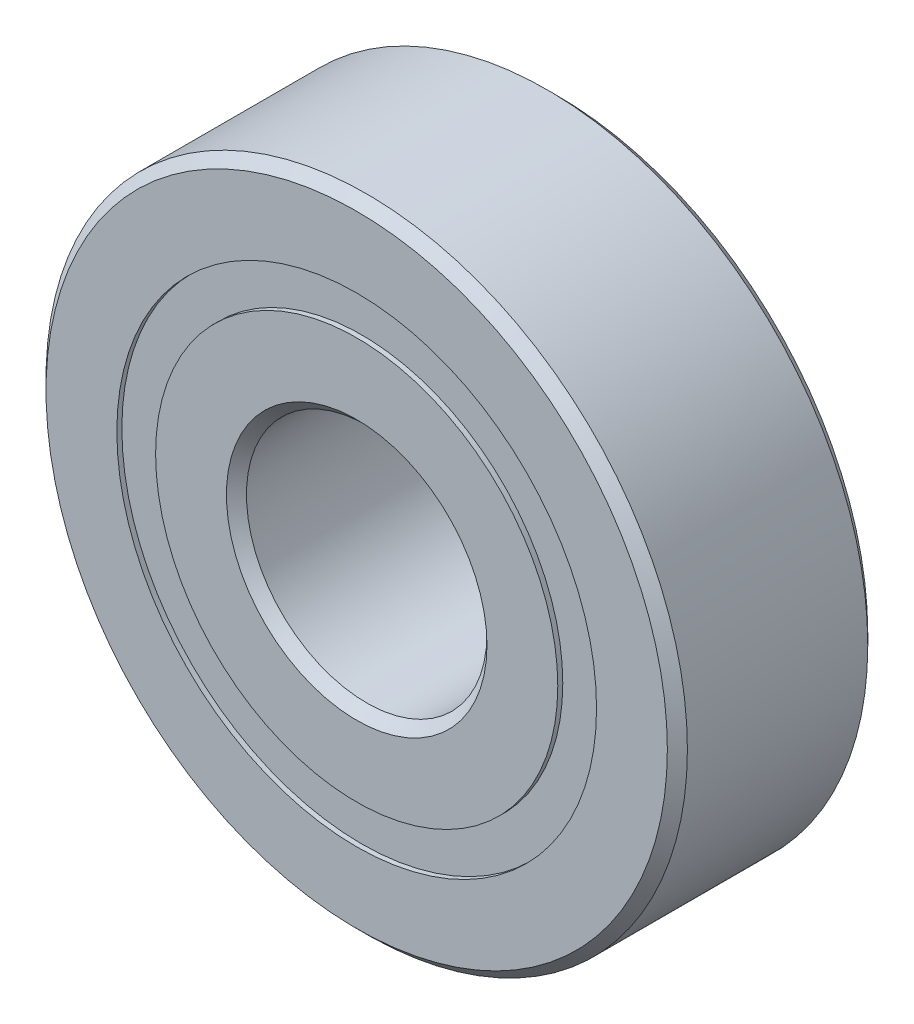
ISO-10303-21;
HEADER;
FILE_DESCRIPTION(('STEP AP214'),'2;1');
FILE_NAME('part.step','',(''),(''),'','','');
FILE_SCHEMA(('AUTOMOTIVE_DESIGN { 1 0 10303 214 1 1 1 1 }'));
ENDSEC;
DATA;
#1=APPLICATION_CONTEXT('core data for automotive mechanical design processes');
#2=APPLICATION_PROTOCOL_DEFINITION('international standard','automotive_design',2000,#1);
#3=PRODUCT_CONTEXT('',#1,'mechanical');
#4=PRODUCT('Part','Part','',(#3));
#5=PRODUCT_RELATED_PRODUCT_CATEGORY('part','',(#4));
#6=PRODUCT_DEFINITION_FORMATION('','',#4);
#7=PRODUCT_DEFINITION_CONTEXT('part definition',#1,'design');
#8=PRODUCT_DEFINITION('design','',#6,#7);
#9=PRODUCT_DEFINITION_SHAPE('','',#8);
#10=(LENGTH_UNIT() NAMED_UNIT(*) SI_UNIT(.MILLI.,.METRE.));
#11=(NAMED_UNIT(*) PLANE_ANGLE_UNIT() SI_UNIT($,.RADIAN.));
#12=(NAMED_UNIT(*) SI_UNIT($,.STERADIAN.) SOLID_ANGLE_UNIT());
#13=UNCERTAINTY_MEASURE_WITH_UNIT(LENGTH_MEASURE(1.E-05),#10,'distance_accuracy_value','');
#14=(GEOMETRIC_REPRESENTATION_CONTEXT(3) GLOBAL_UNCERTAINTY_ASSIGNED_CONTEXT((#13)) GLOBAL_UNIT_ASSIGNED_CONTEXT((#10,
#11,#12)) REPRESENTATION_CONTEXT('',''));
#15=CARTESIAN_POINT('',(0.,0.,0.));
#16=DIRECTION('',(0.,0.,1.));
#17=DIRECTION('',(1.,0.,0.));
#18=AXIS2_PLACEMENT_3D('',#15,#16,#17);
#19=CARTESIAN_POINT('',(0.,11.967032967033,-4.75));
#20=DIRECTION('',(0.,0.,1.));
#21=DIRECTION('',(1.,0.,0.));
#22=AXIS2_PLACEMENT_3D('',#19,#20,#21);
#23=PLANE('',#22);
#24=CARTESIAN_POINT('',(0.,0.,-4.75));
#25=DIRECTION('',(0.,0.,1.));
#26=DIRECTION('',(1.,0.,0.));
#27=AXIS2_PLACEMENT_3D('',#24,#25,#26);
#28=CIRCLE('',#27,11.967032967033);
#29=CARTESIAN_POINT('',(11.967032967033,0.,-4.75));
#30=VERTEX_POINT('',#29);
#31=EDGE_CURVE('E59',#30,#30,#28,.T.);
#32=ORIENTED_EDGE('',*,*,#31,.F.);
#33=EDGE_LOOP('',(#32));
#34=FACE_BOUND('',#33,.T.);
#35=CARTESIAN_POINT('',(0.,0.,-4.75));
#36=DIRECTION('',(0.,0.,1.));
#37=DIRECTION('',(1.,0.,0.));
#38=AXIS2_PLACEMENT_3D('',#35,#36,#37);
#39=CIRCLE('',#38,10.032967032967);
#40=CARTESIAN_POINT('',(10.032967032967,0.,-4.75));
#41=VERTEX_POINT('',#40);
#42=EDGE_CURVE('E11',#41,#41,#39,.T.);
#43=ORIENTED_EDGE('',*,*,#42,.T.);
#44=EDGE_LOOP('',(#43));
#45=FACE_BOUND('',#44,.T.);
#46=ADVANCED_FACE('F45',(#34,#45),#23,.F.);
#47=CARTESIAN_POINT('',(0.,0.,5.));
#48=DIRECTION('',(0.,0.,1.));
#49=DIRECTION('',(1.,0.,0.));
#50=AXIS2_PLACEMENT_3D('',#47,#48,#49);
#51=CYLINDRICAL_SURFACE('',#50,10.032967032967);
#52=ORIENTED_EDGE('',*,*,#42,.F.);
#53=EDGE_LOOP('',(#52));
#54=FACE_BOUND('',#53,.T.);
#55=CARTESIAN_POINT('',(0.,0.,-2.42351487807829));
#56=DIRECTION('',(0.,0.,1.));
#57=DIRECTION('',(1.,0.,0.));
#58=AXIS2_PLACEMENT_3D('',#55,#56,#57);
#59=CIRCLE('',#58,10.032967032967);
#60=CARTESIAN_POINT('',(10.032967032967,0.,-2.42351487807829));
#61=VERTEX_POINT('',#60);
#62=EDGE_CURVE('E51',#61,#61,#59,.T.);
#63=ORIENTED_EDGE('',*,*,#62,.T.);
#64=EDGE_LOOP('',(#63));
#65=FACE_BOUND('',#64,.T.);
#66=ADVANCED_FACE('F68',(#54,#65),#51,.F.);
#67=CARTESIAN_POINT('',(0.,11.967032967033,-2.42351487807829));
#68=DIRECTION('',(0.,0.,-1.));
#69=DIRECTION('',(-1.,0.,0.));
#70=AXIS2_PLACEMENT_3D('',#67,#68,#69);
#71=PLANE('',#70);
#72=ORIENTED_EDGE('',*,*,#62,.F.);
#73=EDGE_LOOP('',(#72));
#74=FACE_BOUND('',#73,.T.);
#75=CARTESIAN_POINT('',(0.,0.,-2.42351487807829));
#76=DIRECTION('',(0.,0.,1.));
#77=DIRECTION('',(1.,0.,0.));
#78=AXIS2_PLACEMENT_3D('',#75,#76,#77);
#79=CIRCLE('',#78,11.967032967033);
#80=CARTESIAN_POINT('',(11.967032967033,0.,-2.42351487807829));
#81=VERTEX_POINT('',#80);
#82=EDGE_CURVE('E55',#81,#81,#79,.T.);
#83=ORIENTED_EDGE('',*,*,#82,.T.);
#84=EDGE_LOOP('',(#83));
#85=FACE_BOUND('',#84,.T.);
#86=ADVANCED_FACE('F72',(#74,#85),#71,.F.);
#87=CARTESIAN_POINT('',(0.,0.,5.));
#88=DIRECTION('',(0.,0.,1.));
#89=DIRECTION('',(1.,0.,0.));
#90=AXIS2_PLACEMENT_3D('',#87,#88,#89);
#91=CYLINDRICAL_SURFACE('',#90,11.967032967033);
#92=ORIENTED_EDGE('',*,*,#82,.F.);
#93=EDGE_LOOP('',(#92));
#94=FACE_BOUND('',#93,.T.);
#95=ORIENTED_EDGE('',*,*,#31,.T.);
#96=EDGE_LOOP('',(#95));
#97=FACE_BOUND('',#96,.T.);
#98=ADVANCED_FACE('F65',(#94,#97),#91,.T.);
#99=CLOSED_SHELL('',(#46,#66,#86,#98));
#100=MANIFOLD_SOLID_BREP('B2',#99);
#101=CARTESIAN_POINT('',(0.,11.967032967033,4.75));
#102=DIRECTION('',(0.,0.,-1.));
#103=DIRECTION('',(-1.,0.,0.));
#104=AXIS2_PLACEMENT_3D('',#101,#102,#103);
#105=PLANE('',#104);
#106=CARTESIAN_POINT('',(0.,0.,4.75));
#107=DIRECTION('',(0.,0.,1.));
#108=DIRECTION('',(1.,0.,0.));
#109=AXIS2_PLACEMENT_3D('',#106,#107,#108);
#110=CIRCLE('',#109,10.032967032967);
#111=CARTESIAN_POINT('',(10.032967032967,0.,4.75));
#112=VERTEX_POINT('',#111);
#113=EDGE_CURVE('E44',#112,#112,#110,.T.);
#114=ORIENTED_EDGE('',*,*,#113,.F.);
#115=EDGE_LOOP('',(#114));
#116=FACE_BOUND('',#115,.T.);
#117=CARTESIAN_POINT('',(0.,0.,4.75));
#118=DIRECTION('',(0.,0.,1.));
#119=DIRECTION('',(1.,0.,0.));
#120=AXIS2_PLACEMENT_3D('',#117,#118,#119);
#121=CIRCLE('',#120,11.967032967033);
#122=CARTESIAN_POINT('',(11.967032967033,0.,4.75));
#123=VERTEX_POINT('',#122);
#124=EDGE_CURVE('E128',#123,#123,#121,.T.);
#125=ORIENTED_EDGE('',*,*,#124,.T.);
#126=EDGE_LOOP('',(#125));
#127=FACE_BOUND('',#126,.T.);
#128=ADVANCED_FACE('F112',(#116,#127),#105,.F.);
#129=CARTESIAN_POINT('',(0.,0.,5.));
#130=DIRECTION('',(0.,0.,1.));
#131=DIRECTION('',(1.,0.,0.));
#132=AXIS2_PLACEMENT_3D('',#129,#130,#131);
#133=CYLINDRICAL_SURFACE('',#132,10.032967032967);
#134=CARTESIAN_POINT('',(0.,0.,2.42351487807829));
#135=DIRECTION('',(0.,0.,1.));
#136=DIRECTION('',(1.,0.,0.));
#137=AXIS2_PLACEMENT_3D('',#134,#135,#136);
#138=CIRCLE('',#137,10.032967032967);
#139=CARTESIAN_POINT('',(10.032967032967,0.,2.42351487807829));
#140=VERTEX_POINT('',#139);
#141=EDGE_CURVE('E118',#140,#140,#138,.T.);
#142=ORIENTED_EDGE('',*,*,#141,.F.);
#143=EDGE_LOOP('',(#142));
#144=FACE_BOUND('',#143,.T.);
#145=ORIENTED_EDGE('',*,*,#113,.T.);
#146=EDGE_LOOP('',(#145));
#147=FACE_BOUND('',#146,.T.);
#148=ADVANCED_FACE('F143',(#144,#147),#133,.F.);
#149=CARTESIAN_POINT('',(0.,11.967032967033,2.42351487807829));
#150=DIRECTION('',(0.,0.,1.));
#151=DIRECTION('',(1.,0.,0.));
#152=AXIS2_PLACEMENT_3D('',#149,#150,#151);
#153=PLANE('',#152);
#154=CARTESIAN_POINT('',(0.,0.,2.42351487807829));
#155=DIRECTION('',(0.,0.,1.));
#156=DIRECTION('',(1.,0.,0.));
#157=AXIS2_PLACEMENT_3D('',#154,#155,#156);
#158=CIRCLE('',#157,11.967032967033);
#159=CARTESIAN_POINT('',(11.967032967033,0.,2.42351487807829));
#160=VERTEX_POINT('',#159);
#161=EDGE_CURVE('E123',#160,#160,#158,.T.);
#162=ORIENTED_EDGE('',*,*,#161,.F.);
#163=EDGE_LOOP('',(#162));
#164=FACE_BOUND('',#163,.T.);
#165=ORIENTED_EDGE('',*,*,#141,.T.);
#166=EDGE_LOOP('',(#165));
#167=FACE_BOUND('',#166,.T.);
#168=ADVANCED_FACE('F138',(#164,#167),#153,.F.);
#169=CARTESIAN_POINT('',(0.,0.,5.));
#170=DIRECTION('',(0.,0.,1.));
#171=DIRECTION('',(1.,0.,0.));
#172=AXIS2_PLACEMENT_3D('',#169,#170,#171);
#173=CYLINDRICAL_SURFACE('',#172,11.967032967033);
#174=ORIENTED_EDGE('',*,*,#124,.F.);
#175=EDGE_LOOP('',(#174));
#176=FACE_BOUND('',#175,.T.);
#177=ORIENTED_EDGE('',*,*,#161,.T.);
#178=EDGE_LOOP('',(#177));
#179=FACE_BOUND('',#178,.T.);
#180=ADVANCED_FACE('F135',(#176,#179),#173,.T.);
#181=CLOSED_SHELL('',(#128,#148,#168,#180));
#182=MANIFOLD_SOLID_BREP('B6',#181);
#183=CARTESIAN_POINT('',(-5.49999999999988,9.5262794416289,0.));
#184=DIRECTION('',(0.,0.,1.));
#185=DIRECTION('',(-0.499999999999989,0.866025403784445,0.));
#186=AXIS2_PLACEMENT_3D('',#183,#184,#185);
#187=SPHERICAL_SURFACE('',#186,2.42351487807829);
#188=CARTESIAN_POINT('',(-5.49999999999988,9.5262794416289,2.42351487807829));
#189=VERTEX_POINT('',#188);
#190=VERTEX_LOOP('',#189);
#191=FACE_BOUND('',#190,.T.);
#192=ADVANCED_FACE('F181',(#191),#187,.T.);
#193=CLOSED_SHELL('',(#192));
#194=MANIFOLD_SOLID_BREP('B39',#193);
#195=CARTESIAN_POINT('',(-9.52627944162876,5.50000000000011,0.));
#196=DIRECTION('',(0.,0.,1.));
#197=DIRECTION('',(-0.866025403784433,0.50000000000001,0.));
#198=AXIS2_PLACEMENT_3D('',#195,#196,#197);
#199=SPHERICAL_SURFACE('',#198,2.42351487807829);
#200=CARTESIAN_POINT('',(-9.52627944162876,5.50000000000011,2.42351487807829));
#201=VERTEX_POINT('',#200);
#202=VERTEX_LOOP('',#201);
#203=FACE_BOUND('',#202,.T.);
#204=ADVANCED_FACE('F201',(#203),#199,.T.);
#205=CLOSED_SHELL('',(#204));
#206=MANIFOLD_SOLID_BREP('B108',#205);
#207=CARTESIAN_POINT('',(-11.,1.15218884181823E-13,0.));
#208=DIRECTION('',(0.,0.,1.));
#209=DIRECTION('',(-1.,0.,0.));
#210=AXIS2_PLACEMENT_3D('',#207,#208,#209);
#211=SPHERICAL_SURFACE('',#210,2.42351487807829);
#212=CARTESIAN_POINT('',(-11.,1.15218884181823E-13,2.42351487807829));
#213=VERTEX_POINT('',#212);
#214=VERTEX_LOOP('',#213);
#215=FACE_BOUND('',#214,.T.);
#216=ADVANCED_FACE('F221',(#215),#211,.T.);
#217=CLOSED_SHELL('',(#216));
#218=MANIFOLD_SOLID_BREP('B177',#217);
#219=CARTESIAN_POINT('',(-9.52627944162887,-5.49999999999991,0.));
#220=DIRECTION('',(0.,0.,1.));
#221=DIRECTION('',(-0.866025403784443,-0.499999999999992,0.));
#222=AXIS2_PLACEMENT_3D('',#219,#220,#221);
#223=SPHERICAL_SURFACE('',#222,2.42351487807829);
#224=CARTESIAN_POINT('',(-9.52627944162887,-5.49999999999991,2.42351487807829));
#225=VERTEX_POINT('',#224);
#226=VERTEX_LOOP('',#225);
#227=FACE_BOUND('',#226,.T.);
#228=ADVANCED_FACE('F241',(#227),#223,.T.);
#229=CLOSED_SHELL('',(#228));
#230=MANIFOLD_SOLID_BREP('B197',#229);
#231=CARTESIAN_POINT('',(-5.50000000000008,-9.52627944162878,0.));
#232=DIRECTION('',(0.,0.,1.));
#233=DIRECTION('',(-0.500000000000007,-0.866025403784435,0.));
#234=AXIS2_PLACEMENT_3D('',#231,#232,#233);
#235=SPHERICAL_SURFACE('',#234,2.42351487807829);
#236=CARTESIAN_POINT('',(-5.50000000000008,-9.52627944162878,2.42351487807829));
#237=VERTEX_POINT('',#236);
#238=VERTEX_LOOP('',#237);
#239=FACE_BOUND('',#238,.T.);
#240=ADVANCED_FACE('F261',(#239),#235,.T.);
#241=CLOSED_SHELL('',(#240));
#242=MANIFOLD_SOLID_BREP('B217',#241);
#243=CARTESIAN_POINT('',(0.,-11.,0.));
#244=DIRECTION('',(0.,0.,1.));
#245=DIRECTION('',(0.,-1.,0.));
#246=AXIS2_PLACEMENT_3D('',#243,#244,#245);
#247=SPHERICAL_SURFACE('',#246,2.42351487807829);
#248=CARTESIAN_POINT('',(0.,-11.,2.42351487807829));
#249=VERTEX_POINT('',#248);
#250=VERTEX_LOOP('',#249);
#251=FACE_BOUND('',#250,.T.);
#252=ADVANCED_FACE('F281',(#251),#247,.T.);
#253=CLOSED_SHELL('',(#252));
#254=MANIFOLD_SOLID_BREP('B237',#253);
#255=CARTESIAN_POINT('',(5.49999999999994,-9.52627944162886,0.));
#256=DIRECTION('',(0.,0.,1.));
#257=DIRECTION('',(0.499999999999995,-0.866025403784442,0.));
#258=AXIS2_PLACEMENT_3D('',#255,#256,#257);
#259=SPHERICAL_SURFACE('',#258,2.42351487807829);
#260=CARTESIAN_POINT('',(5.49999999999994,-9.52627944162886,2.42351487807829));
#261=VERTEX_POINT('',#260);
#262=VERTEX_LOOP('',#261);
#263=FACE_BOUND('',#262,.T.);
#264=ADVANCED_FACE('F301',(#263),#259,.T.);
#265=CLOSED_SHELL('',(#264));
#266=MANIFOLD_SOLID_BREP('B257',#265);
#267=CARTESIAN_POINT('',(9.5262794416288,-5.50000000000004,0.));
#268=DIRECTION('',(0.,0.,1.));
#269=DIRECTION('',(0.866025403784436,-0.500000000000004,0.));
#270=AXIS2_PLACEMENT_3D('',#267,#268,#269);
#271=SPHERICAL_SURFACE('',#270,2.42351487807829);
#272=CARTESIAN_POINT('',(9.5262794416288,-5.50000000000004,2.42351487807829));
#273=VERTEX_POINT('',#272);
#274=VERTEX_LOOP('',#273);
#275=FACE_BOUND('',#274,.T.);
#276=ADVANCED_FACE('F322',(#275),#271,.T.);
#277=CLOSED_SHELL('',(#276));
#278=MANIFOLD_SOLID_BREP('B277',#277);
#279=CARTESIAN_POINT('',(11.,0.,0.));
#280=DIRECTION('',(0.,0.,1.));
#281=DIRECTION('',(1.,0.,0.));
#282=AXIS2_PLACEMENT_3D('',#279,#280,#281);
#283=SPHERICAL_SURFACE('',#282,2.42351487807829);
#284=CARTESIAN_POINT('',(11.,0.,2.42351487807829));
#285=VERTEX_POINT('',#284);
#286=VERTEX_LOOP('',#285);
#287=FACE_BOUND('',#286,.T.);
#288=ADVANCED_FACE('F342',(#287),#283,.T.);
#289=CLOSED_SHELL('',(#288));
#290=MANIFOLD_SOLID_BREP('B297',#289);
#291=CARTESIAN_POINT('',(9.52627944162884,5.49999999999998,0.));
#292=DIRECTION('',(0.,0.,1.));
#293=DIRECTION('',(0.86602540378444,0.499999999999998,0.));
#294=AXIS2_PLACEMENT_3D('',#291,#292,#293);
#295=SPHERICAL_SURFACE('',#294,2.42351487807829);
#296=CARTESIAN_POINT('',(9.52627944162884,5.49999999999998,2.42351487807829));
#297=VERTEX_POINT('',#296);
#298=VERTEX_LOOP('',#297);
#299=FACE_BOUND('',#298,.T.);
#300=ADVANCED_FACE('F362',(#299),#295,.T.);
#301=CLOSED_SHELL('',(#300));
#302=MANIFOLD_SOLID_BREP('B318',#301);
#303=CARTESIAN_POINT('',(5.50000000000001,9.52627944162882,0.));
#304=DIRECTION('',(0.,0.,1.));
#305=DIRECTION('',(0.500000000000001,0.866025403784438,0.));
#306=AXIS2_PLACEMENT_3D('',#303,#304,#305);
#307=SPHERICAL_SURFACE('',#306,2.42351487807829);
#308=CARTESIAN_POINT('',(5.50000000000001,9.52627944162882,2.42351487807829));
#309=VERTEX_POINT('',#308);
#310=VERTEX_LOOP('',#309);
#311=FACE_BOUND('',#310,.T.);
#312=ADVANCED_FACE('F382',(#311),#307,.T.);
#313=CLOSED_SHELL('',(#312));
#314=MANIFOLD_SOLID_BREP('B338',#313);
#315=CARTESIAN_POINT('',(0.,11.,0.));
#316=DIRECTION('',(0.,0.,1.));
#317=DIRECTION('',(0.,1.,0.));
#318=AXIS2_PLACEMENT_3D('',#315,#316,#317);
#319=SPHERICAL_SURFACE('',#318,2.42351487807829);
#320=CARTESIAN_POINT('',(0.,11.,2.42351487807829));
#321=VERTEX_POINT('',#320);
#322=VERTEX_LOOP('',#321);
#323=FACE_BOUND('',#322,.T.);
#324=ADVANCED_FACE('F404',(#323),#319,.T.);
#325=CLOSED_SHELL('',(#324));
#326=MANIFOLD_SOLID_BREP('B358',#325);
#327=CARTESIAN_POINT('',(0.,10.032967032967,5.));
#328=DIRECTION('',(0.,0.,-1.));
#329=DIRECTION('',(-1.,0.,0.));
#330=AXIS2_PLACEMENT_3D('',#327,#328,#329);
#331=PLANE('',#330);
#332=CARTESIAN_POINT('',(0.,0.,5.));
#333=DIRECTION('',(0.,0.,1.));
#334=DIRECTION('',(1.,0.,0.));
#335=AXIS2_PLACEMENT_3D('',#332,#333,#334);
#336=CIRCLE('',#335,6.5);
#337=CARTESIAN_POINT('',(6.5,0.,5.));
#338=VERTEX_POINT('',#337);
#339=EDGE_CURVE('E454',#338,#338,#336,.T.);
#340=ORIENTED_EDGE('',*,*,#339,.F.);
#341=EDGE_LOOP('',(#340));
#342=FACE_BOUND('',#341,.T.);
#343=CARTESIAN_POINT('',(0.,0.,5.));
#344=DIRECTION('',(0.,0.,1.));
#345=DIRECTION('',(1.,0.,0.));
#346=AXIS2_PLACEMENT_3D('',#343,#344,#345);
#347=CIRCLE('',#346,10.032967032967);
#348=CARTESIAN_POINT('',(10.032967032967,0.,5.));
#349=VERTEX_POINT('',#348);
#350=EDGE_CURVE('E403',#349,#349,#347,.T.);
#351=ORIENTED_EDGE('',*,*,#350,.T.);
#352=EDGE_LOOP('',(#351));
#353=FACE_BOUND('',#352,.T.);
#354=ADVANCED_FACE('F423',(#342,#353),#331,.F.);
#355=CARTESIAN_POINT('',(0.,0.,5.));
#356=DIRECTION('',(0.,0.,1.));
#357=DIRECTION('',(1.,0.,0.));
#358=AXIS2_PLACEMENT_3D('',#355,#356,#357);
#359=CYLINDRICAL_SURFACE('',#358,10.032967032967);
#360=ORIENTED_EDGE('',*,*,#350,.F.);
#361=EDGE_LOOP('',(#360));
#362=FACE_BOUND('',#361,.T.);
#363=CARTESIAN_POINT('',(0.,0.,2.22222222222222));
#364=DIRECTION('',(0.,0.,1.));
#365=DIRECTION('',(1.,0.,0.));
#366=AXIS2_PLACEMENT_3D('',#363,#364,#365);
#367=CIRCLE('',#366,10.032967032967);
#368=CARTESIAN_POINT('',(10.032967032967,0.,2.22222222222222));
#369=VERTEX_POINT('',#368);
#370=EDGE_CURVE('E429',#369,#369,#367,.T.);
#371=ORIENTED_EDGE('',*,*,#370,.T.);
#372=EDGE_LOOP('',(#371));
#373=FACE_BOUND('',#372,.T.);
#374=ADVANCED_FACE('F461',(#362,#373),#359,.T.);
#375=CARTESIAN_POINT('',(0.,0.,0.));
#376=DIRECTION('',(0.,0.,1.));
#377=DIRECTION('',(1.,0.,0.));
#378=AXIS2_PLACEMENT_3D('',#375,#376,#377);
#379=TOROIDAL_SURFACE('',#378,11.,2.42351487807829);
#380=ORIENTED_EDGE('',*,*,#370,.F.);
#381=EDGE_LOOP('',(#380));
#382=FACE_BOUND('',#381,.T.);
#383=CARTESIAN_POINT('',(0.,0.,-2.22222222222223));
#384=DIRECTION('',(0.,0.,1.));
#385=DIRECTION('',(1.,0.,0.));
#386=AXIS2_PLACEMENT_3D('',#383,#384,#385);
#387=CIRCLE('',#386,10.032967032967);
#388=CARTESIAN_POINT('',(10.032967032967,0.,-2.22222222222223));
#389=VERTEX_POINT('',#388);
#390=EDGE_CURVE('E434',#389,#389,#387,.T.);
#391=ORIENTED_EDGE('',*,*,#390,.T.);
#392=EDGE_LOOP('',(#391));
#393=FACE_BOUND('',#392,.T.);
#394=ADVANCED_FACE('F465',(#382,#393),#379,.F.);
#395=CARTESIAN_POINT('',(0.,0.,5.));
#396=DIRECTION('',(0.,0.,1.));
#397=DIRECTION('',(1.,0.,0.));
#398=AXIS2_PLACEMENT_3D('',#395,#396,#397);
#399=CYLINDRICAL_SURFACE('',#398,10.032967032967);
#400=ORIENTED_EDGE('',*,*,#390,.F.);
#401=EDGE_LOOP('',(#400));
#402=FACE_BOUND('',#401,.T.);
#403=CARTESIAN_POINT('',(0.,0.,-5.));
#404=DIRECTION('',(0.,0.,1.));
#405=DIRECTION('',(1.,0.,0.));
#406=AXIS2_PLACEMENT_3D('',#403,#404,#405);
#407=CIRCLE('',#406,10.032967032967);
#408=CARTESIAN_POINT('',(10.032967032967,0.,-5.));
#409=VERTEX_POINT('',#408);
#410=EDGE_CURVE('E439',#409,#409,#407,.T.);
#411=ORIENTED_EDGE('',*,*,#410,.T.);
#412=EDGE_LOOP('',(#411));
#413=FACE_BOUND('',#412,.T.);
#414=ADVANCED_FACE('F470',(#402,#413),#399,.T.);
#415=CARTESIAN_POINT('',(0.,6.49999999999999,-5.));
#416=DIRECTION('',(0.,0.,1.));
#417=DIRECTION('',(1.,0.,0.));
#418=AXIS2_PLACEMENT_3D('',#415,#416,#417);
#419=PLANE('',#418);
#420=ORIENTED_EDGE('',*,*,#410,.F.);
#421=EDGE_LOOP('',(#420));
#422=FACE_BOUND('',#421,.T.);
#423=CARTESIAN_POINT('',(0.,0.,-5.));
#424=DIRECTION('',(0.,0.,1.));
#425=DIRECTION('',(1.,0.,0.));
#426=AXIS2_PLACEMENT_3D('',#423,#424,#425);
#427=CIRCLE('',#426,6.49999999999999);
#428=CARTESIAN_POINT('',(6.49999999999999,0.,-5.));
#429=VERTEX_POINT('',#428);
#430=EDGE_CURVE('E444',#429,#429,#427,.T.);
#431=ORIENTED_EDGE('',*,*,#430,.T.);
#432=EDGE_LOOP('',(#431));
#433=FACE_BOUND('',#432,.T.);
#434=ADVANCED_FACE('F476',(#422,#433),#419,.F.);
#435=CARTESIAN_POINT('',(0.,0.,-4.5));
#436=DIRECTION('',(0.,0.,-1.));
#437=DIRECTION('',(-1.,0.,0.));
#438=AXIS2_PLACEMENT_3D('',#435,#436,#437);
#439=CONICAL_SURFACE('',#438,6.,0.785398163397438);
#440=ORIENTED_EDGE('',*,*,#430,.F.);
#441=EDGE_LOOP('',(#440));
#442=FACE_BOUND('',#441,.T.);
#443=CARTESIAN_POINT('',(0.,0.,-4.5));
#444=DIRECTION('',(0.,0.,1.));
#445=DIRECTION('',(1.,0.,0.));
#446=AXIS2_PLACEMENT_3D('',#443,#444,#445);
#447=CIRCLE('',#446,6.);
#448=CARTESIAN_POINT('',(6.,0.,-4.5));
#449=VERTEX_POINT('',#448);
#450=EDGE_CURVE('E447',#449,#449,#447,.T.);
#451=ORIENTED_EDGE('',*,*,#450,.T.);
#452=EDGE_LOOP('',(#451));
#453=FACE_BOUND('',#452,.T.);
#454=ADVANCED_FACE('F480',(#442,#453),#439,.F.);
#455=CARTESIAN_POINT('',(0.,0.,5.));
#456=DIRECTION('',(0.,0.,1.));
#457=DIRECTION('',(1.,0.,0.));
#458=AXIS2_PLACEMENT_3D('',#455,#456,#457);
#459=CYLINDRICAL_SURFACE('',#458,6.);
#460=ORIENTED_EDGE('',*,*,#450,.F.);
#461=EDGE_LOOP('',(#460));
#462=FACE_BOUND('',#461,.T.);
#463=CARTESIAN_POINT('',(0.,0.,4.50000000000001));
#464=DIRECTION('',(0.,0.,1.));
#465=DIRECTION('',(1.,0.,0.));
#466=AXIS2_PLACEMENT_3D('',#463,#464,#465);
#467=CIRCLE('',#466,6.);
#468=CARTESIAN_POINT('',(6.,0.,4.50000000000001));
#469=VERTEX_POINT('',#468);
#470=EDGE_CURVE('E451',#469,#469,#467,.T.);
#471=ORIENTED_EDGE('',*,*,#470,.T.);
#472=EDGE_LOOP('',(#471));
#473=FACE_BOUND('',#472,.T.);
#474=ADVANCED_FACE('F484',(#462,#473),#459,.F.);
#475=CARTESIAN_POINT('',(0.,0.,5.));
#476=DIRECTION('',(0.,0.,1.));
#477=DIRECTION('',(1.,0.,0.));
#478=AXIS2_PLACEMENT_3D('',#475,#476,#477);
#479=CONICAL_SURFACE('',#478,6.5,0.785398163397458);
#480=ORIENTED_EDGE('',*,*,#470,.F.);
#481=EDGE_LOOP('',(#480));
#482=FACE_BOUND('',#481,.T.);
#483=ORIENTED_EDGE('',*,*,#339,.T.);
#484=EDGE_LOOP('',(#483));
#485=FACE_BOUND('',#484,.T.);
#486=ADVANCED_FACE('F458',(#482,#485),#479,.F.);
#487=CLOSED_SHELL('',(#354,#374,#394,#414,#434,#454,#474,#486));
#488=MANIFOLD_SOLID_BREP('B378',#487);
#489=CARTESIAN_POINT('',(0.,0.,4.5));
#490=DIRECTION('',(0.,0.,-1.));
#491=DIRECTION('',(-1.,0.,0.));
#492=AXIS2_PLACEMENT_3D('',#489,#490,#491);
#493=CONICAL_SURFACE('',#492,16.,0.785398163397441);
#494=CARTESIAN_POINT('',(0.,0.,5.));
#495=DIRECTION('',(0.,0.,1.));
#496=DIRECTION('',(1.,0.,0.));
#497=AXIS2_PLACEMENT_3D('',#494,#495,#496);
#498=CIRCLE('',#497,15.5);
#499=CARTESIAN_POINT('',(15.5,0.,5.));
#500=VERTEX_POINT('',#499);
#501=EDGE_CURVE('E580',#500,#500,#498,.T.);
#502=ORIENTED_EDGE('',*,*,#501,.F.);
#503=EDGE_LOOP('',(#502));
#504=FACE_BOUND('',#503,.T.);
#505=CARTESIAN_POINT('',(0.,0.,4.5));
#506=DIRECTION('',(0.,0.,1.));
#507=DIRECTION('',(1.,0.,0.));
#508=AXIS2_PLACEMENT_3D('',#505,#506,#507);
#509=CIRCLE('',#508,16.);
#510=CARTESIAN_POINT('',(16.,0.,4.5));
#511=VERTEX_POINT('',#510);
#512=EDGE_CURVE('E422',#511,#511,#509,.T.);
#513=ORIENTED_EDGE('',*,*,#512,.T.);
#514=EDGE_LOOP('',(#513));
#515=FACE_BOUND('',#514,.T.);
#516=ADVANCED_FACE('F549',(#504,#515),#493,.T.);
#517=CARTESIAN_POINT('',(0.,0.,5.));
#518=DIRECTION('',(0.,0.,1.));
#519=DIRECTION('',(1.,0.,0.));
#520=AXIS2_PLACEMENT_3D('',#517,#518,#519);
#521=CYLINDRICAL_SURFACE('',#520,16.);
#522=ORIENTED_EDGE('',*,*,#512,.F.);
#523=EDGE_LOOP('',(#522));
#524=FACE_BOUND('',#523,.T.);
#525=CARTESIAN_POINT('',(0.,0.,-4.5));
#526=DIRECTION('',(0.,0.,1.));
#527=DIRECTION('',(1.,0.,0.));
#528=AXIS2_PLACEMENT_3D('',#525,#526,#527);
#529=CIRCLE('',#528,16.);
#530=CARTESIAN_POINT('',(16.,0.,-4.5));
#531=VERTEX_POINT('',#530);
#532=EDGE_CURVE('E556',#531,#531,#529,.T.);
#533=ORIENTED_EDGE('',*,*,#532,.T.);
#534=EDGE_LOOP('',(#533));
#535=FACE_BOUND('',#534,.T.);
#536=ADVANCED_FACE('F587',(#524,#535),#521,.T.);
#537=CARTESIAN_POINT('',(0.,0.,-5.));
#538=DIRECTION('',(0.,0.,1.));
#539=DIRECTION('',(1.,0.,0.));
#540=AXIS2_PLACEMENT_3D('',#537,#538,#539);
#541=CONICAL_SURFACE('',#540,15.5,0.785398163397438);
#542=ORIENTED_EDGE('',*,*,#532,.F.);
#543=EDGE_LOOP('',(#542));
#544=FACE_BOUND('',#543,.T.);
#545=CARTESIAN_POINT('',(0.,0.,-5.));
#546=DIRECTION('',(0.,0.,1.));
#547=DIRECTION('',(1.,0.,0.));
#548=AXIS2_PLACEMENT_3D('',#545,#546,#547);
#549=CIRCLE('',#548,15.5);
#550=CARTESIAN_POINT('',(15.5,0.,-5.));
#551=VERTEX_POINT('',#550);
#552=EDGE_CURVE('E561',#551,#551,#549,.T.);
#553=ORIENTED_EDGE('',*,*,#552,.T.);
#554=EDGE_LOOP('',(#553));
#555=FACE_BOUND('',#554,.T.);
#556=ADVANCED_FACE('F591',(#544,#555),#541,.T.);
#557=CARTESIAN_POINT('',(0.,15.5,-5.));
#558=DIRECTION('',(0.,0.,1.));
#559=DIRECTION('',(1.,0.,0.));
#560=AXIS2_PLACEMENT_3D('',#557,#558,#559);
#561=PLANE('',#560);
#562=ORIENTED_EDGE('',*,*,#552,.F.);
#563=EDGE_LOOP('',(#562));
#564=FACE_BOUND('',#563,.T.);
#565=CARTESIAN_POINT('',(0.,0.,-5.));
#566=DIRECTION('',(0.,0.,1.));
#567=DIRECTION('',(1.,0.,0.));
#568=AXIS2_PLACEMENT_3D('',#565,#566,#567);
#569=CIRCLE('',#568,11.967032967033);
#570=CARTESIAN_POINT('',(11.967032967033,0.,-5.));
#571=VERTEX_POINT('',#570);
#572=EDGE_CURVE('E565',#571,#571,#569,.T.);
#573=ORIENTED_EDGE('',*,*,#572,.T.);
#574=EDGE_LOOP('',(#573));
#575=FACE_BOUND('',#574,.T.);
#576=ADVANCED_FACE('F596',(#564,#575),#561,.F.);
#577=CARTESIAN_POINT('',(0.,0.,5.));
#578=DIRECTION('',(0.,0.,1.));
#579=DIRECTION('',(1.,0.,0.));
#580=AXIS2_PLACEMENT_3D('',#577,#578,#579);
#581=CYLINDRICAL_SURFACE('',#580,11.967032967033);
#582=ORIENTED_EDGE('',*,*,#572,.F.);
#583=EDGE_LOOP('',(#582));
#584=FACE_BOUND('',#583,.T.);
#585=CARTESIAN_POINT('',(0.,0.,-2.22222222222222));
#586=DIRECTION('',(0.,0.,1.));
#587=DIRECTION('',(1.,0.,0.));
#588=AXIS2_PLACEMENT_3D('',#585,#586,#587);
#589=CIRCLE('',#588,11.967032967033);
#590=CARTESIAN_POINT('',(11.967032967033,0.,-2.22222222222222));
#591=VERTEX_POINT('',#590);
#592=EDGE_CURVE('E570',#591,#591,#589,.T.);
#593=ORIENTED_EDGE('',*,*,#592,.T.);
#594=EDGE_LOOP('',(#593));
#595=FACE_BOUND('',#594,.T.);
#596=ADVANCED_FACE('F602',(#584,#595),#581,.F.);
#597=CARTESIAN_POINT('',(0.,0.,0.));
#598=DIRECTION('',(0.,0.,1.));
#599=DIRECTION('',(1.,0.,0.));
#600=AXIS2_PLACEMENT_3D('',#597,#598,#599);
#601=TOROIDAL_SURFACE('',#600,11.,2.42351487807829);
#602=ORIENTED_EDGE('',*,*,#592,.F.);
#603=EDGE_LOOP('',(#602));
#604=FACE_BOUND('',#603,.T.);
#605=CARTESIAN_POINT('',(0.,0.,2.22222222222222));
#606=DIRECTION('',(0.,0.,1.));
#607=DIRECTION('',(1.,0.,0.));
#608=AXIS2_PLACEMENT_3D('',#605,#606,#607);
#609=CIRCLE('',#608,11.967032967033);
#610=CARTESIAN_POINT('',(11.967032967033,0.,2.22222222222222));
#611=VERTEX_POINT('',#610);
#612=EDGE_CURVE('E573',#611,#611,#609,.T.);
#613=ORIENTED_EDGE('',*,*,#612,.T.);
#614=EDGE_LOOP('',(#613));
#615=FACE_BOUND('',#614,.T.);
#616=ADVANCED_FACE('F606',(#604,#615),#601,.F.);
#617=CARTESIAN_POINT('',(0.,0.,5.));
#618=DIRECTION('',(0.,0.,1.));
#619=DIRECTION('',(1.,0.,0.));
#620=AXIS2_PLACEMENT_3D('',#617,#618,#619);
#621=CYLINDRICAL_SURFACE('',#620,11.967032967033);
#622=ORIENTED_EDGE('',*,*,#612,.F.);
#623=EDGE_LOOP('',(#622));
#624=FACE_BOUND('',#623,.T.);
#625=CARTESIAN_POINT('',(0.,0.,5.));
#626=DIRECTION('',(0.,0.,1.));
#627=DIRECTION('',(1.,0.,0.));
#628=AXIS2_PLACEMENT_3D('',#625,#626,#627);
#629=CIRCLE('',#628,11.967032967033);
#630=CARTESIAN_POINT('',(11.967032967033,0.,5.));
#631=VERTEX_POINT('',#630);
#632=EDGE_CURVE('E577',#631,#631,#629,.T.);
#633=ORIENTED_EDGE('',*,*,#632,.T.);
#634=EDGE_LOOP('',(#633));
#635=FACE_BOUND('',#634,.T.);
#636=ADVANCED_FACE('F610',(#624,#635),#621,.F.);
#637=CARTESIAN_POINT('',(0.,15.5,5.));
#638=DIRECTION('',(0.,0.,-1.));
#639=DIRECTION('',(-1.,0.,0.));
#640=AXIS2_PLACEMENT_3D('',#637,#638,#639);
#641=PLANE('',#640);
#642=ORIENTED_EDGE('',*,*,#632,.F.);
#643=EDGE_LOOP('',(#642));
#644=FACE_BOUND('',#643,.T.);
#645=ORIENTED_EDGE('',*,*,#501,.T.);
#646=EDGE_LOOP('',(#645));
#647=FACE_BOUND('',#646,.T.);
#648=ADVANCED_FACE('F584',(#644,#647),#641,.F.);
#649=CLOSED_SHELL('',(#516,#536,#556,#576,#596,#616,#636,#648));
#650=MANIFOLD_SOLID_BREP('B398',#649);
#651=ADVANCED_BREP_SHAPE_REPRESENTATION('',(#18,#100,#182,#194,#206,#218,#230,#242,#254,#266,
#278,#290,#302,#314,#326,#488,#650),#14);
#652=SHAPE_DEFINITION_REPRESENTATION(#9,#651);
ENDSEC;
END-ISO-10303-21;
